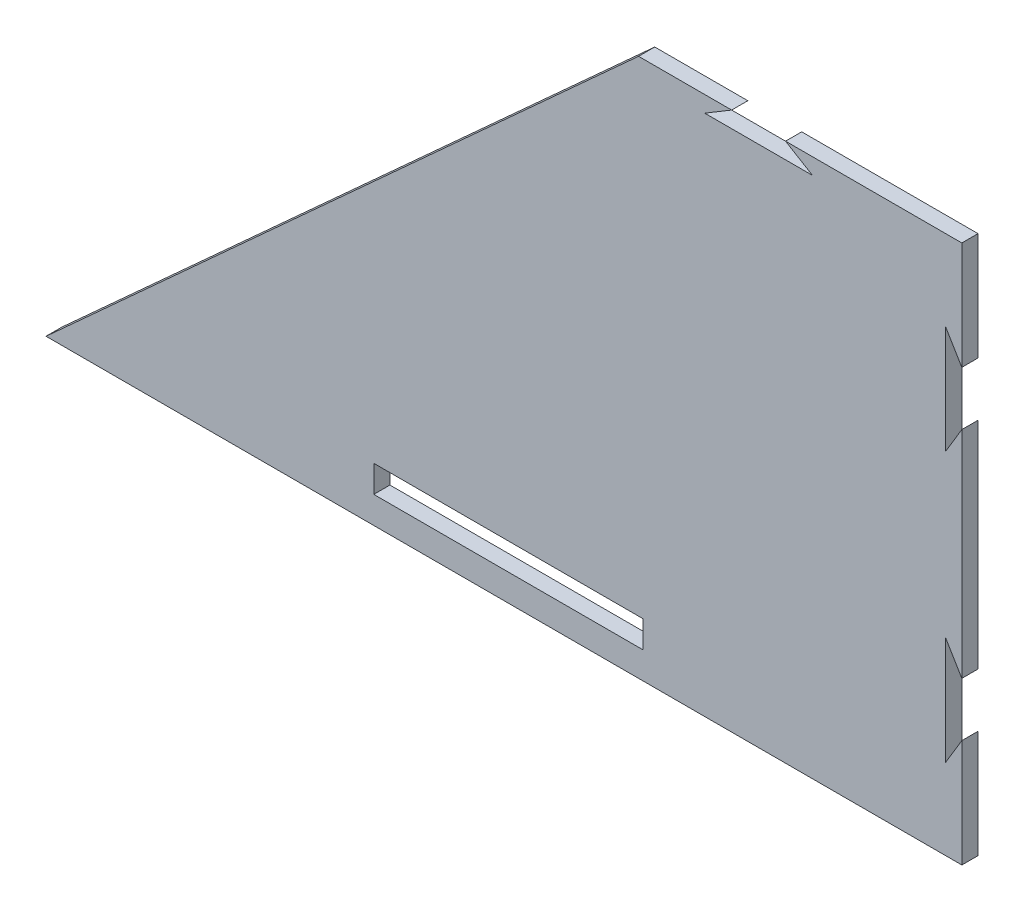
ISO-10303-21;
HEADER;
FILE_DESCRIPTION(('STEP AP214'),'2;1');
FILE_NAME('part.step','',(''),(''),'','','');
FILE_SCHEMA(('AUTOMOTIVE_DESIGN { 1 0 10303 214 1 1 1 1 }'));
ENDSEC;
DATA;
#1=APPLICATION_CONTEXT('core data for automotive mechanical design processes');
#2=APPLICATION_PROTOCOL_DEFINITION('international standard','automotive_design',2000,#1);
#3=PRODUCT_CONTEXT('',#1,'mechanical');
#4=PRODUCT('Part','Part','',(#3));
#5=PRODUCT_RELATED_PRODUCT_CATEGORY('part','',(#4));
#6=PRODUCT_DEFINITION_FORMATION('','',#4);
#7=PRODUCT_DEFINITION_CONTEXT('part definition',#1,'design');
#8=PRODUCT_DEFINITION('design','',#6,#7);
#9=PRODUCT_DEFINITION_SHAPE('','',#8);
#10=(LENGTH_UNIT() NAMED_UNIT(*) SI_UNIT(.MILLI.,.METRE.));
#11=(NAMED_UNIT(*) PLANE_ANGLE_UNIT() SI_UNIT($,.RADIAN.));
#12=(NAMED_UNIT(*) SI_UNIT($,.STERADIAN.) SOLID_ANGLE_UNIT());
#13=UNCERTAINTY_MEASURE_WITH_UNIT(LENGTH_MEASURE(1.E-05),#10,'distance_accuracy_value','');
#14=(GEOMETRIC_REPRESENTATION_CONTEXT(3) GLOBAL_UNCERTAINTY_ASSIGNED_CONTEXT((#13)) GLOBAL_UNIT_ASSIGNED_CONTEXT((#10,
#11,#12)) REPRESENTATION_CONTEXT('',''));
#15=CARTESIAN_POINT('',(0.,0.,0.));
#16=DIRECTION('',(0.,0.,1.));
#17=DIRECTION('',(1.,0.,0.));
#18=AXIS2_PLACEMENT_3D('',#15,#16,#17);
#19=CARTESIAN_POINT('',(91.7278977526352,-71.9753086419754,3.));
#20=DIRECTION('',(-1.,0.,0.));
#21=DIRECTION('',(0.,0.,1.));
#22=AXIS2_PLACEMENT_3D('',#19,#20,#21);
#23=PLANE('',#22);
#24=DIRECTION('',(0.,1.,0.));
#25=VECTOR('',#24,1.);
#26=CARTESIAN_POINT('',(91.7278977526352,-71.9753086419754,0.));
#27=LINE('',#26,#25);
#28=CARTESIAN_POINT('',(91.7278977526352,-41.9753086419754,0.));
#29=VERTEX_POINT('',#28);
#30=CARTESIAN_POINT('',(91.7278977526352,-1.97530864197536,0.));
#31=VERTEX_POINT('',#30);
#32=EDGE_CURVE('E303',#29,#31,#27,.T.);
#33=ORIENTED_EDGE('',*,*,#32,.T.);
#34=DIRECTION('',(0.,0.,1.));
#35=VECTOR('',#34,1.);
#36=CARTESIAN_POINT('',(91.7278977526352,-1.97530864197536,0.));
#37=LINE('',#36,#35);
#38=CARTESIAN_POINT('',(91.7278977526352,-1.97530864197536,3.));
#39=VERTEX_POINT('',#38);
#40=EDGE_CURVE('E226',#31,#39,#37,.T.);
#41=ORIENTED_EDGE('',*,*,#40,.T.);
#42=DIRECTION('',(0.,1.,0.));
#43=VECTOR('',#42,1.);
#44=CARTESIAN_POINT('',(91.7278977526352,-71.9753086419754,3.));
#45=LINE('',#44,#43);
#46=CARTESIAN_POINT('',(91.7278977526352,-41.9753086419754,3.));
#47=VERTEX_POINT('',#46);
#48=EDGE_CURVE('E289',#47,#39,#45,.T.);
#49=ORIENTED_EDGE('',*,*,#48,.F.);
#50=DIRECTION('',(0.,0.,1.));
#51=VECTOR('',#50,1.);
#52=CARTESIAN_POINT('',(91.7278977526352,-41.9753086419754,0.));
#53=LINE('',#52,#51);
#54=EDGE_CURVE('E245',#29,#47,#53,.T.);
#55=ORIENTED_EDGE('',*,*,#54,.F.);
#56=EDGE_LOOP('',(#33,#41,#49,#55));
#57=FACE_BOUND('',#56,.T.);
#58=ADVANCED_FACE('F33',(#57),#23,.F.);
#59=CARTESIAN_POINT('',(91.7278977526352,-71.9753086419754,0.));
#60=VERTEX_POINT('',#59);
#61=CARTESIAN_POINT('',(91.7278977526352,-51.9753086419754,0.));
#62=VERTEX_POINT('',#61);
#63=EDGE_CURVE('E299',#60,#62,#27,.T.);
#64=ORIENTED_EDGE('',*,*,#63,.T.);
#65=DIRECTION('',(0.,0.,1.));
#66=VECTOR('',#65,1.);
#67=CARTESIAN_POINT('',(91.7278977526352,-51.9753086419754,0.));
#68=LINE('',#67,#66);
#69=CARTESIAN_POINT('',(91.7278977526352,-51.9753086419754,3.));
#70=VERTEX_POINT('',#69);
#71=EDGE_CURVE('E222',#62,#70,#68,.T.);
#72=ORIENTED_EDGE('',*,*,#71,.T.);
#73=CARTESIAN_POINT('',(91.7278977526352,-71.9753086419754,3.));
#74=VERTEX_POINT('',#73);
#75=EDGE_CURVE('E285',#74,#70,#45,.T.);
#76=ORIENTED_EDGE('',*,*,#75,.F.);
#77=DIRECTION('',(0.,0.,-1.));
#78=VECTOR('',#77,1.);
#79=CARTESIAN_POINT('',(91.7278977526352,-71.9753086419754,3.));
#80=LINE('',#79,#78);
#81=EDGE_CURVE('E298',#74,#60,#80,.T.);
#82=ORIENTED_EDGE('',*,*,#81,.T.);
#83=EDGE_LOOP('',(#64,#72,#76,#82));
#84=FACE_BOUND('',#83,.T.);
#85=ADVANCED_FACE('F333',(#84),#23,.F.);
#86=CARTESIAN_POINT('',(31.7278977526352,28.0246913580246,3.));
#87=DIRECTION('',(0.,-1.,0.));
#88=DIRECTION('',(0.,0.,-1.));
#89=AXIS2_PLACEMENT_3D('',#86,#87,#88);
#90=PLANE('',#89);
#91=DIRECTION('',(0.,0.,-1.));
#92=VECTOR('',#91,1.);
#93=CARTESIAN_POINT('',(59.0020861881907,28.0246913580246,253.317054774153));
#94=LINE('',#93,#92);
#95=CARTESIAN_POINT('',(59.0020861881907,28.0246913580246,3.));
#96=VERTEX_POINT('',#95);
#97=CARTESIAN_POINT('',(59.0020861881907,28.0246913580246,0.));
#98=VERTEX_POINT('',#97);
#99=EDGE_CURVE('E278',#96,#98,#94,.T.);
#100=ORIENTED_EDGE('',*,*,#99,.F.);
#101=DIRECTION('',(-1.,0.,0.));
#102=VECTOR('',#101,1.);
#103=CARTESIAN_POINT('',(31.7278977526352,28.0246913580246,3.));
#104=LINE('',#103,#102);
#105=CARTESIAN_POINT('',(91.7278977526352,28.0246913580246,3.));
#106=VERTEX_POINT('',#105);
#107=EDGE_CURVE('E291',#106,#96,#104,.T.);
#108=ORIENTED_EDGE('',*,*,#107,.F.);
#109=DIRECTION('',(0.,0.,-1.));
#110=VECTOR('',#109,1.);
#111=CARTESIAN_POINT('',(91.7278977526352,28.0246913580246,3.));
#112=LINE('',#111,#110);
#113=CARTESIAN_POINT('',(91.7278977526352,28.0246913580246,0.));
#114=VERTEX_POINT('',#113);
#115=EDGE_CURVE('E11',#106,#114,#112,.T.);
#116=ORIENTED_EDGE('',*,*,#115,.T.);
#117=DIRECTION('',(-1.,0.,0.));
#118=VECTOR('',#117,1.);
#119=CARTESIAN_POINT('',(31.7278977526352,28.0246913580246,0.));
#120=LINE('',#119,#118);
#121=EDGE_CURVE('E304',#114,#98,#120,.T.);
#122=ORIENTED_EDGE('',*,*,#121,.T.);
#123=EDGE_LOOP('',(#100,#108,#116,#122));
#124=FACE_BOUND('',#123,.T.);
#125=ADVANCED_FACE('F355',(#124),#90,.F.);
#126=DIRECTION('',(0.,0.,-1.));
#127=VECTOR('',#126,1.);
#128=CARTESIAN_POINT('',(49.0020861881907,28.0246913580246,253.317054774153));
#129=LINE('',#128,#127);
#130=CARTESIAN_POINT('',(49.0020861881907,28.0246913580247,3.));
#131=VERTEX_POINT('',#130);
#132=CARTESIAN_POINT('',(49.0020861881907,28.0246913580246,0.));
#133=VERTEX_POINT('',#132);
#134=EDGE_CURVE('E262',#131,#133,#129,.T.);
#135=ORIENTED_EDGE('',*,*,#134,.T.);
#136=CARTESIAN_POINT('',(31.7278977526352,28.0246913580246,0.));
#137=VERTEX_POINT('',#136);
#138=EDGE_CURVE('E302',#133,#137,#120,.T.);
#139=ORIENTED_EDGE('',*,*,#138,.T.);
#140=DIRECTION('',(0.,0.,-1.));
#141=VECTOR('',#140,1.);
#142=CARTESIAN_POINT('',(31.7278977526352,28.0246913580246,3.));
#143=LINE('',#142,#141);
#144=CARTESIAN_POINT('',(31.7278977526352,28.0246913580246,3.));
#145=VERTEX_POINT('',#144);
#146=EDGE_CURVE('E41',#145,#137,#143,.T.);
#147=ORIENTED_EDGE('',*,*,#146,.F.);
#148=EDGE_CURVE('E288',#131,#145,#104,.T.);
#149=ORIENTED_EDGE('',*,*,#148,.F.);
#150=EDGE_LOOP('',(#135,#139,#147,#149));
#151=FACE_BOUND('',#150,.T.);
#152=ADVANCED_FACE('F341',(#151),#90,.F.);
#153=CARTESIAN_POINT('',(0.,0.,3.));
#154=DIRECTION('',(0.,0.,-1.));
#155=DIRECTION('',(-1.,0.,0.));
#156=AXIS2_PLACEMENT_3D('',#153,#154,#155);
#157=PLANE('',#156);
#158=DIRECTION('',(-1.,0.,0.));
#159=VECTOR('',#158,1.);
#160=CARTESIAN_POINT('',(-17.4311719482176,-61.9753086419754,3.));
#161=LINE('',#160,#159);
#162=CARTESIAN_POINT('',(32.5688280517824,-61.9753086419754,3.));
#163=VERTEX_POINT('',#162);
#164=CARTESIAN_POINT('',(-17.4311719482176,-61.9753086419754,3.));
#165=VERTEX_POINT('',#164);
#166=EDGE_CURVE('E197',#163,#165,#161,.T.);
#167=ORIENTED_EDGE('',*,*,#166,.F.);
#168=DIRECTION('',(0.,1.,0.));
#169=VECTOR('',#168,1.);
#170=CARTESIAN_POINT('',(32.5688280517824,-61.9753086419754,3.));
#171=LINE('',#170,#169);
#172=CARTESIAN_POINT('',(32.5688280517824,-66.9753086419754,3.));
#173=VERTEX_POINT('',#172);
#174=EDGE_CURVE('E48',#173,#163,#171,.T.);
#175=ORIENTED_EDGE('',*,*,#174,.F.);
#176=DIRECTION('',(1.,0.,0.));
#177=VECTOR('',#176,1.);
#178=CARTESIAN_POINT('',(-17.4311719482176,-66.9753086419754,3.));
#179=LINE('',#178,#177);
#180=CARTESIAN_POINT('',(-17.4311719482176,-66.9753086419754,3.));
#181=VERTEX_POINT('',#180);
#182=EDGE_CURVE('E188',#181,#173,#179,.T.);
#183=ORIENTED_EDGE('',*,*,#182,.F.);
#184=DIRECTION('',(0.,-1.,0.));
#185=VECTOR('',#184,1.);
#186=CARTESIAN_POINT('',(-17.4311719482176,-61.9753086419754,3.));
#187=LINE('',#186,#185);
#188=EDGE_CURVE('E191',#165,#181,#187,.T.);
#189=ORIENTED_EDGE('',*,*,#188,.F.);
#190=EDGE_LOOP('',(#167,#175,#183,#189));
#191=FACE_BOUND('',#190,.T.);
#192=ORIENTED_EDGE('',*,*,#48,.T.);
#193=DIRECTION('',(0.514495755427527,0.857492925712544,0.));
#194=VECTOR('',#193,1.);
#195=CARTESIAN_POINT('',(88.7278977526352,-6.97530864197536,3.));
#196=LINE('',#195,#194);
#197=CARTESIAN_POINT('',(88.7278977526352,-6.97530864197536,3.));
#198=VERTEX_POINT('',#197);
#199=EDGE_CURVE('E211',#198,#39,#196,.T.);
#200=ORIENTED_EDGE('',*,*,#199,.F.);
#201=DIRECTION('',(0.,-1.,0.));
#202=VECTOR('',#201,1.);
#203=CARTESIAN_POINT('',(88.7278977526352,13.0246913580246,3.));
#204=LINE('',#203,#202);
#205=CARTESIAN_POINT('',(88.7278977526352,13.0246913580246,3.));
#206=VERTEX_POINT('',#205);
#207=EDGE_CURVE('E221',#206,#198,#204,.T.);
#208=ORIENTED_EDGE('',*,*,#207,.F.);
#209=DIRECTION('',(-0.514495755427527,0.857492925712544,0.));
#210=VECTOR('',#209,1.);
#211=CARTESIAN_POINT('',(91.7278977526352,8.02469135802464,3.));
#212=LINE('',#211,#210);
#213=CARTESIAN_POINT('',(91.7278977526352,8.02469135802464,3.));
#214=VERTEX_POINT('',#213);
#215=EDGE_CURVE('E218',#214,#206,#212,.T.);
#216=ORIENTED_EDGE('',*,*,#215,.F.);
#217=EDGE_CURVE('E290',#214,#106,#45,.T.);
#218=ORIENTED_EDGE('',*,*,#217,.T.);
#219=ORIENTED_EDGE('',*,*,#107,.T.);
#220=DIRECTION('',(0.857492925712544,-0.514495755427527,0.));
#221=VECTOR('',#220,1.);
#222=CARTESIAN_POINT('',(64.0020861881907,25.0246913580246,3.));
#223=LINE('',#222,#221);
#224=CARTESIAN_POINT('',(64.0020861881907,25.0246913580246,3.));
#225=VERTEX_POINT('',#224);
#226=EDGE_CURVE('E229',#96,#225,#223,.T.);
#227=ORIENTED_EDGE('',*,*,#226,.T.);
#228=DIRECTION('',(-1.,0.,0.));
#229=VECTOR('',#228,1.);
#230=CARTESIAN_POINT('',(44.0020861881907,25.0246913580246,3.));
#231=LINE('',#230,#229);
#232=CARTESIAN_POINT('',(44.0020861881907,25.0246913580246,3.));
#233=VERTEX_POINT('',#232);
#234=EDGE_CURVE('E271',#225,#233,#231,.T.);
#235=ORIENTED_EDGE('',*,*,#234,.T.);
#236=DIRECTION('',(0.857492925712544,0.514495755427527,0.));
#237=VECTOR('',#236,1.);
#238=CARTESIAN_POINT('',(49.0020861881907,28.0246913580246,3.));
#239=LINE('',#238,#237);
#240=EDGE_CURVE('E267',#233,#131,#239,.T.);
#241=ORIENTED_EDGE('',*,*,#240,.T.);
#242=ORIENTED_EDGE('',*,*,#148,.T.);
#243=DIRECTION('',(-0.739940073395944,-0.672672793996313,0.));
#244=VECTOR('',#243,1.);
#245=CARTESIAN_POINT('',(-78.2721022473648,-71.9753086419754,3.));
#246=LINE('',#245,#244);
#247=CARTESIAN_POINT('',(-78.2721022473648,-71.9753086419754,3.));
#248=VERTEX_POINT('',#247);
#249=EDGE_CURVE('E294',#145,#248,#246,.T.);
#250=ORIENTED_EDGE('',*,*,#249,.T.);
#251=DIRECTION('',(1.,0.,0.));
#252=VECTOR('',#251,1.);
#253=CARTESIAN_POINT('',(-78.2721022473648,-71.9753086419754,3.));
#254=LINE('',#253,#252);
#255=EDGE_CURVE('E296',#248,#74,#254,.T.);
#256=ORIENTED_EDGE('',*,*,#255,.T.);
#257=ORIENTED_EDGE('',*,*,#75,.T.);
#258=DIRECTION('',(0.514495755427527,0.857492925712544,0.));
#259=VECTOR('',#258,1.);
#260=CARTESIAN_POINT('',(88.7278977526352,-56.9753086419754,3.));
#261=LINE('',#260,#259);
#262=CARTESIAN_POINT('',(88.7278977526352,-56.9753086419754,3.));
#263=VERTEX_POINT('',#262);
#264=EDGE_CURVE('E239',#263,#70,#261,.T.);
#265=ORIENTED_EDGE('',*,*,#264,.F.);
#266=DIRECTION('',(0.,-1.,0.));
#267=VECTOR('',#266,1.);
#268=CARTESIAN_POINT('',(88.7278977526352,-36.9753086419754,3.));
#269=LINE('',#268,#267);
#270=CARTESIAN_POINT('',(88.7278977526352,-36.9753086419754,3.));
#271=VERTEX_POINT('',#270);
#272=EDGE_CURVE('E248',#271,#263,#269,.T.);
#273=ORIENTED_EDGE('',*,*,#272,.F.);
#274=DIRECTION('',(-0.514495755427527,0.857492925712544,0.));
#275=VECTOR('',#274,1.);
#276=CARTESIAN_POINT('',(91.7278977526352,-41.9753086419754,3.));
#277=LINE('',#276,#275);
#278=EDGE_CURVE('E203',#47,#271,#277,.T.);
#279=ORIENTED_EDGE('',*,*,#278,.F.);
#280=EDGE_LOOP('',(#192,#200,#208,#216,#218,#219,#227,#235,#241,#242,#250,#256,#257,#265,#273,#279));
#281=FACE_BOUND('',#280,.T.);
#282=ADVANCED_FACE('F337',(#191,#281),#157,.F.);
#283=ORIENTED_EDGE('',*,*,#217,.F.);
#284=DIRECTION('',(0.,0.,1.));
#285=VECTOR('',#284,1.);
#286=CARTESIAN_POINT('',(91.7278977526352,8.02469135802464,0.));
#287=LINE('',#286,#285);
#288=CARTESIAN_POINT('',(91.7278977526352,8.02469135802464,0.));
#289=VERTEX_POINT('',#288);
#290=EDGE_CURVE('E217',#289,#214,#287,.T.);
#291=ORIENTED_EDGE('',*,*,#290,.F.);
#292=EDGE_CURVE('E284',#289,#114,#27,.T.);
#293=ORIENTED_EDGE('',*,*,#292,.T.);
#294=ORIENTED_EDGE('',*,*,#115,.F.);
#295=EDGE_LOOP('',(#283,#291,#293,#294));
#296=FACE_BOUND('',#295,.T.);
#297=ADVANCED_FACE('F35',(#296),#23,.F.);
#298=CARTESIAN_POINT('',(-78.2721022473648,-71.9753086419754,3.));
#299=DIRECTION('',(0.672672793996312,-0.739940073395944,0.));
#300=DIRECTION('',(0.739940073395944,0.672672793996313,0.));
#301=AXIS2_PLACEMENT_3D('',#298,#299,#300);
#302=PLANE('',#301);
#303=DIRECTION('',(-0.739940073395944,-0.672672793996313,0.));
#304=VECTOR('',#303,1.);
#305=CARTESIAN_POINT('',(-78.2721022473648,-71.9753086419754,0.));
#306=LINE('',#305,#304);
#307=CARTESIAN_POINT('',(-78.2721022473648,-71.9753086419754,0.));
#308=VERTEX_POINT('',#307);
#309=EDGE_CURVE('E307',#137,#308,#306,.T.);
#310=ORIENTED_EDGE('',*,*,#309,.T.);
#311=DIRECTION('',(0.,0.,-1.));
#312=VECTOR('',#311,1.);
#313=CARTESIAN_POINT('',(-78.2721022473648,-71.9753086419754,3.));
#314=LINE('',#313,#312);
#315=EDGE_CURVE('E313',#248,#308,#314,.T.);
#316=ORIENTED_EDGE('',*,*,#315,.F.);
#317=ORIENTED_EDGE('',*,*,#249,.F.);
#318=ORIENTED_EDGE('',*,*,#146,.T.);
#319=EDGE_LOOP('',(#310,#316,#317,#318));
#320=FACE_BOUND('',#319,.T.);
#321=ADVANCED_FACE('F320',(#320),#302,.F.);
#322=CARTESIAN_POINT('',(-78.2721022473648,-71.9753086419754,3.));
#323=DIRECTION('',(0.,1.,0.));
#324=DIRECTION('',(0.,0.,1.));
#325=AXIS2_PLACEMENT_3D('',#322,#323,#324);
#326=PLANE('',#325);
#327=DIRECTION('',(1.,0.,0.));
#328=VECTOR('',#327,1.);
#329=CARTESIAN_POINT('',(-78.2721022473648,-71.9753086419754,0.));
#330=LINE('',#329,#328);
#331=EDGE_CURVE('E309',#308,#60,#330,.T.);
#332=ORIENTED_EDGE('',*,*,#331,.T.);
#333=ORIENTED_EDGE('',*,*,#81,.F.);
#334=ORIENTED_EDGE('',*,*,#255,.F.);
#335=ORIENTED_EDGE('',*,*,#315,.T.);
#336=EDGE_LOOP('',(#332,#333,#334,#335));
#337=FACE_BOUND('',#336,.T.);
#338=ADVANCED_FACE('F329',(#337),#326,.F.);
#339=CARTESIAN_POINT('',(0.,0.,0.));
#340=DIRECTION('',(0.,0.,-1.));
#341=DIRECTION('',(-1.,0.,0.));
#342=AXIS2_PLACEMENT_3D('',#339,#340,#341);
#343=PLANE('',#342);
#344=DIRECTION('',(0.,1.,0.));
#345=VECTOR('',#344,1.);
#346=CARTESIAN_POINT('',(32.5688280517824,-61.9753086419754,0.));
#347=LINE('',#346,#345);
#348=CARTESIAN_POINT('',(32.5688280517824,-66.9753086419754,0.));
#349=VERTEX_POINT('',#348);
#350=CARTESIAN_POINT('',(32.5688280517824,-61.9753086419754,0.));
#351=VERTEX_POINT('',#350);
#352=EDGE_CURVE('E172',#349,#351,#347,.T.);
#353=ORIENTED_EDGE('',*,*,#352,.T.);
#354=DIRECTION('',(-1.,0.,0.));
#355=VECTOR('',#354,1.);
#356=CARTESIAN_POINT('',(-17.4311719482176,-61.9753086419754,0.));
#357=LINE('',#356,#355);
#358=CARTESIAN_POINT('',(-17.4311719482176,-61.9753086419754,0.));
#359=VERTEX_POINT('',#358);
#360=EDGE_CURVE('E181',#351,#359,#357,.T.);
#361=ORIENTED_EDGE('',*,*,#360,.T.);
#362=DIRECTION('',(0.,-1.,0.));
#363=VECTOR('',#362,1.);
#364=CARTESIAN_POINT('',(-17.4311719482176,-61.9753086419754,0.));
#365=LINE('',#364,#363);
#366=CARTESIAN_POINT('',(-17.4311719482176,-66.9753086419754,0.));
#367=VERTEX_POINT('',#366);
#368=EDGE_CURVE('E56',#359,#367,#365,.T.);
#369=ORIENTED_EDGE('',*,*,#368,.T.);
#370=DIRECTION('',(1.,0.,0.));
#371=VECTOR('',#370,1.);
#372=CARTESIAN_POINT('',(-17.4311719482176,-66.9753086419754,0.));
#373=LINE('',#372,#371);
#374=EDGE_CURVE('E178',#367,#349,#373,.T.);
#375=ORIENTED_EDGE('',*,*,#374,.T.);
#376=EDGE_LOOP('',(#353,#361,#369,#375));
#377=FACE_BOUND('',#376,.T.);
#378=DIRECTION('',(0.514495755427527,0.857492925712544,0.));
#379=VECTOR('',#378,1.);
#380=CARTESIAN_POINT('',(88.7278977526352,-6.97530864197536,0.));
#381=LINE('',#380,#379);
#382=CARTESIAN_POINT('',(88.7278977526352,-6.97530864197536,0.));
#383=VERTEX_POINT('',#382);
#384=EDGE_CURVE('E214',#383,#31,#381,.T.);
#385=ORIENTED_EDGE('',*,*,#384,.T.);
#386=ORIENTED_EDGE('',*,*,#32,.F.);
#387=DIRECTION('',(-0.514495755427527,0.857492925712544,0.));
#388=VECTOR('',#387,1.);
#389=CARTESIAN_POINT('',(91.7278977526352,-41.9753086419754,0.));
#390=LINE('',#389,#388);
#391=CARTESIAN_POINT('',(88.7278977526352,-36.9753086419754,0.));
#392=VERTEX_POINT('',#391);
#393=EDGE_CURVE('E235',#29,#392,#390,.T.);
#394=ORIENTED_EDGE('',*,*,#393,.T.);
#395=DIRECTION('',(0.,-1.,0.));
#396=VECTOR('',#395,1.);
#397=CARTESIAN_POINT('',(88.7278977526352,-36.9753086419754,0.));
#398=LINE('',#397,#396);
#399=CARTESIAN_POINT('',(88.7278977526352,-56.9753086419754,0.));
#400=VERTEX_POINT('',#399);
#401=EDGE_CURVE('E238',#392,#400,#398,.T.);
#402=ORIENTED_EDGE('',*,*,#401,.T.);
#403=DIRECTION('',(0.514495755427527,0.857492925712544,0.));
#404=VECTOR('',#403,1.);
#405=CARTESIAN_POINT('',(88.7278977526352,-56.9753086419754,0.));
#406=LINE('',#405,#404);
#407=EDGE_CURVE('E242',#400,#62,#406,.T.);
#408=ORIENTED_EDGE('',*,*,#407,.T.);
#409=ORIENTED_EDGE('',*,*,#63,.F.);
#410=ORIENTED_EDGE('',*,*,#331,.F.);
#411=ORIENTED_EDGE('',*,*,#309,.F.);
#412=ORIENTED_EDGE('',*,*,#138,.F.);
#413=DIRECTION('',(0.857492925712544,0.514495755427527,0.));
#414=VECTOR('',#413,1.);
#415=CARTESIAN_POINT('',(49.0020861881907,28.0246913580246,0.));
#416=LINE('',#415,#414);
#417=CARTESIAN_POINT('',(44.0020861881907,25.0246913580246,0.));
#418=VERTEX_POINT('',#417);
#419=EDGE_CURVE('E264',#418,#133,#416,.T.);
#420=ORIENTED_EDGE('',*,*,#419,.F.);
#421=DIRECTION('',(-1.,0.,0.));
#422=VECTOR('',#421,1.);
#423=CARTESIAN_POINT('',(44.0020861881907,25.0246913580246,0.));
#424=LINE('',#423,#422);
#425=CARTESIAN_POINT('',(64.0020861881907,25.0246913580246,0.));
#426=VERTEX_POINT('',#425);
#427=EDGE_CURVE('E263',#426,#418,#424,.T.);
#428=ORIENTED_EDGE('',*,*,#427,.F.);
#429=DIRECTION('',(0.857492925712544,-0.514495755427527,0.));
#430=VECTOR('',#429,1.);
#431=CARTESIAN_POINT('',(64.0020861881907,25.0246913580246,0.));
#432=LINE('',#431,#430);
#433=EDGE_CURVE('E259',#98,#426,#432,.T.);
#434=ORIENTED_EDGE('',*,*,#433,.F.);
#435=ORIENTED_EDGE('',*,*,#121,.F.);
#436=ORIENTED_EDGE('',*,*,#292,.F.);
#437=DIRECTION('',(-0.514495755427527,0.857492925712544,0.));
#438=VECTOR('',#437,1.);
#439=CARTESIAN_POINT('',(91.7278977526352,8.02469135802464,0.));
#440=LINE('',#439,#438);
#441=CARTESIAN_POINT('',(88.7278977526352,13.0246913580246,0.));
#442=VERTEX_POINT('',#441);
#443=EDGE_CURVE('E207',#289,#442,#440,.T.);
#444=ORIENTED_EDGE('',*,*,#443,.T.);
#445=DIRECTION('',(0.,-1.,0.));
#446=VECTOR('',#445,1.);
#447=CARTESIAN_POINT('',(88.7278977526352,13.0246913580246,0.));
#448=LINE('',#447,#446);
#449=EDGE_CURVE('E210',#442,#383,#448,.T.);
#450=ORIENTED_EDGE('',*,*,#449,.T.);
#451=EDGE_LOOP('',(#385,#386,#394,#402,#408,#409,#410,#411,#412,#420,#428,#434,#435,#436,#444,#450));
#452=FACE_BOUND('',#451,.T.);
#453=ADVANCED_FACE('F185',(#377,#452),#343,.T.);
#454=CARTESIAN_POINT('',(64.0020861881907,25.0246913580246,253.317054774153));
#455=DIRECTION('',(-0.514495755427527,-0.857492925712544,0.));
#456=DIRECTION('',(0.857492925712544,-0.514495755427527,0.));
#457=AXIS2_PLACEMENT_3D('',#454,#455,#456);
#458=PLANE('',#457);
#459=ORIENTED_EDGE('',*,*,#226,.F.);
#460=ORIENTED_EDGE('',*,*,#99,.T.);
#461=ORIENTED_EDGE('',*,*,#433,.T.);
#462=DIRECTION('',(0.,0.,-1.));
#463=VECTOR('',#462,1.);
#464=CARTESIAN_POINT('',(64.0020861881907,25.0246913580246,253.317054774153));
#465=LINE('',#464,#463);
#466=EDGE_CURVE('E281',#225,#426,#465,.T.);
#467=ORIENTED_EDGE('',*,*,#466,.F.);
#468=EDGE_LOOP('',(#459,#460,#461,#467));
#469=FACE_BOUND('',#468,.T.);
#470=ADVANCED_FACE('F351',(#469),#458,.T.);
#471=CARTESIAN_POINT('',(44.0020861881907,25.0246913580246,253.317054774153));
#472=DIRECTION('',(0.,1.,0.));
#473=DIRECTION('',(0.,0.,1.));
#474=AXIS2_PLACEMENT_3D('',#471,#472,#473);
#475=PLANE('',#474);
#476=ORIENTED_EDGE('',*,*,#234,.F.);
#477=ORIENTED_EDGE('',*,*,#466,.T.);
#478=ORIENTED_EDGE('',*,*,#427,.T.);
#479=DIRECTION('',(0.,0.,-1.));
#480=VECTOR('',#479,1.);
#481=CARTESIAN_POINT('',(44.0020861881907,25.0246913580246,253.317054774153));
#482=LINE('',#481,#480);
#483=EDGE_CURVE('E275',#233,#418,#482,.T.);
#484=ORIENTED_EDGE('',*,*,#483,.F.);
#485=EDGE_LOOP('',(#476,#477,#478,#484));
#486=FACE_BOUND('',#485,.T.);
#487=ADVANCED_FACE('F347',(#486),#475,.T.);
#488=CARTESIAN_POINT('',(49.0020861881907,28.0246913580246,253.317054774153));
#489=DIRECTION('',(0.514495755427527,-0.857492925712544,0.));
#490=DIRECTION('',(0.857492925712544,0.514495755427527,0.));
#491=AXIS2_PLACEMENT_3D('',#488,#489,#490);
#492=PLANE('',#491);
#493=ORIENTED_EDGE('',*,*,#240,.F.);
#494=ORIENTED_EDGE('',*,*,#483,.T.);
#495=ORIENTED_EDGE('',*,*,#419,.T.);
#496=ORIENTED_EDGE('',*,*,#134,.F.);
#497=EDGE_LOOP('',(#493,#494,#495,#496));
#498=FACE_BOUND('',#497,.T.);
#499=ADVANCED_FACE('F343',(#498),#492,.T.);
#500=CARTESIAN_POINT('',(88.7278977526352,-56.9753086419754,0.));
#501=DIRECTION('',(0.857492925712544,-0.514495755427527,0.));
#502=DIRECTION('',(0.514495755427527,0.857492925712544,0.));
#503=AXIS2_PLACEMENT_3D('',#500,#501,#502);
#504=PLANE('',#503);
#505=ORIENTED_EDGE('',*,*,#264,.T.);
#506=ORIENTED_EDGE('',*,*,#71,.F.);
#507=ORIENTED_EDGE('',*,*,#407,.F.);
#508=DIRECTION('',(0.,0.,1.));
#509=VECTOR('',#508,1.);
#510=CARTESIAN_POINT('',(88.7278977526352,-56.9753086419754,0.));
#511=LINE('',#510,#509);
#512=EDGE_CURVE('E254',#400,#263,#511,.T.);
#513=ORIENTED_EDGE('',*,*,#512,.T.);
#514=EDGE_LOOP('',(#505,#506,#507,#513));
#515=FACE_BOUND('',#514,.T.);
#516=ADVANCED_FACE('F441',(#515),#504,.F.);
#517=CARTESIAN_POINT('',(88.7278977526352,-36.9753086419754,0.));
#518=DIRECTION('',(-1.,0.,0.));
#519=DIRECTION('',(0.,0.,1.));
#520=AXIS2_PLACEMENT_3D('',#517,#518,#519);
#521=PLANE('',#520);
#522=ORIENTED_EDGE('',*,*,#272,.T.);
#523=ORIENTED_EDGE('',*,*,#512,.F.);
#524=ORIENTED_EDGE('',*,*,#401,.F.);
#525=DIRECTION('',(0.,0.,1.));
#526=VECTOR('',#525,1.);
#527=CARTESIAN_POINT('',(88.7278977526352,-36.9753086419754,0.));
#528=LINE('',#527,#526);
#529=EDGE_CURVE('E256',#392,#271,#528,.T.);
#530=ORIENTED_EDGE('',*,*,#529,.T.);
#531=EDGE_LOOP('',(#522,#523,#524,#530));
#532=FACE_BOUND('',#531,.T.);
#533=ADVANCED_FACE('F464',(#532),#521,.F.);
#534=CARTESIAN_POINT('',(91.7278977526352,-41.9753086419754,0.));
#535=DIRECTION('',(0.857492925712544,0.514495755427527,0.));
#536=DIRECTION('',(-0.514495755427527,0.857492925712544,0.));
#537=AXIS2_PLACEMENT_3D('',#534,#535,#536);
#538=PLANE('',#537);
#539=ORIENTED_EDGE('',*,*,#278,.T.);
#540=ORIENTED_EDGE('',*,*,#529,.F.);
#541=ORIENTED_EDGE('',*,*,#393,.F.);
#542=ORIENTED_EDGE('',*,*,#54,.T.);
#543=EDGE_LOOP('',(#539,#540,#541,#542));
#544=FACE_BOUND('',#543,.T.);
#545=ADVANCED_FACE('F385',(#544),#538,.F.);
#546=CARTESIAN_POINT('',(88.7278977526352,-6.97530864197536,0.));
#547=DIRECTION('',(0.857492925712544,-0.514495755427527,0.));
#548=DIRECTION('',(0.514495755427527,0.857492925712544,0.));
#549=AXIS2_PLACEMENT_3D('',#546,#547,#548);
#550=PLANE('',#549);
#551=ORIENTED_EDGE('',*,*,#199,.T.);
#552=ORIENTED_EDGE('',*,*,#40,.F.);
#553=ORIENTED_EDGE('',*,*,#384,.F.);
#554=DIRECTION('',(0.,0.,1.));
#555=VECTOR('',#554,1.);
#556=CARTESIAN_POINT('',(88.7278977526352,-6.97530864197536,0.));
#557=LINE('',#556,#555);
#558=EDGE_CURVE('E230',#383,#198,#557,.T.);
#559=ORIENTED_EDGE('',*,*,#558,.T.);
#560=EDGE_LOOP('',(#551,#552,#553,#559));
#561=FACE_BOUND('',#560,.T.);
#562=ADVANCED_FACE('F368',(#561),#550,.F.);
#563=CARTESIAN_POINT('',(88.7278977526352,13.0246913580246,0.));
#564=DIRECTION('',(-1.,0.,0.));
#565=DIRECTION('',(0.,0.,1.));
#566=AXIS2_PLACEMENT_3D('',#563,#564,#565);
#567=PLANE('',#566);
#568=ORIENTED_EDGE('',*,*,#207,.T.);
#569=ORIENTED_EDGE('',*,*,#558,.F.);
#570=ORIENTED_EDGE('',*,*,#449,.F.);
#571=DIRECTION('',(0.,0.,1.));
#572=VECTOR('',#571,1.);
#573=CARTESIAN_POINT('',(88.7278977526352,13.0246913580246,0.));
#574=LINE('',#573,#572);
#575=EDGE_CURVE('E232',#442,#206,#574,.T.);
#576=ORIENTED_EDGE('',*,*,#575,.T.);
#577=EDGE_LOOP('',(#568,#569,#570,#576));
#578=FACE_BOUND('',#577,.T.);
#579=ADVANCED_FACE('F377',(#578),#567,.F.);
#580=CARTESIAN_POINT('',(91.7278977526352,8.02469135802464,0.));
#581=DIRECTION('',(0.857492925712544,0.514495755427527,0.));
#582=DIRECTION('',(-0.514495755427527,0.857492925712544,0.));
#583=AXIS2_PLACEMENT_3D('',#580,#581,#582);
#584=PLANE('',#583);
#585=ORIENTED_EDGE('',*,*,#215,.T.);
#586=ORIENTED_EDGE('',*,*,#575,.F.);
#587=ORIENTED_EDGE('',*,*,#443,.F.);
#588=ORIENTED_EDGE('',*,*,#290,.T.);
#589=EDGE_LOOP('',(#585,#586,#587,#588));
#590=FACE_BOUND('',#589,.T.);
#591=ADVANCED_FACE('F375',(#590),#584,.F.);
#592=CARTESIAN_POINT('',(32.5688280517824,-61.9753086419754,0.));
#593=DIRECTION('',(1.,0.,0.));
#594=DIRECTION('',(0.,0.,-1.));
#595=AXIS2_PLACEMENT_3D('',#592,#593,#594);
#596=PLANE('',#595);
#597=ORIENTED_EDGE('',*,*,#174,.T.);
#598=DIRECTION('',(0.,0.,1.));
#599=VECTOR('',#598,1.);
#600=CARTESIAN_POINT('',(32.5688280517824,-61.9753086419754,0.));
#601=LINE('',#600,#599);
#602=EDGE_CURVE('E168',#351,#163,#601,.T.);
#603=ORIENTED_EDGE('',*,*,#602,.F.);
#604=ORIENTED_EDGE('',*,*,#352,.F.);
#605=DIRECTION('',(0.,0.,1.));
#606=VECTOR('',#605,1.);
#607=CARTESIAN_POINT('',(32.5688280517824,-66.9753086419754,0.));
#608=LINE('',#607,#606);
#609=EDGE_CURVE('E201',#349,#173,#608,.T.);
#610=ORIENTED_EDGE('',*,*,#609,.T.);
#611=EDGE_LOOP('',(#597,#603,#604,#610));
#612=FACE_BOUND('',#611,.T.);
#613=ADVANCED_FACE('F170',(#612),#596,.F.);
#614=CARTESIAN_POINT('',(-17.4311719482176,-66.9753086419754,0.));
#615=DIRECTION('',(0.,-1.,0.));
#616=DIRECTION('',(0.,0.,-1.));
#617=AXIS2_PLACEMENT_3D('',#614,#615,#616);
#618=PLANE('',#617);
#619=ORIENTED_EDGE('',*,*,#182,.T.);
#620=ORIENTED_EDGE('',*,*,#609,.F.);
#621=ORIENTED_EDGE('',*,*,#374,.F.);
#622=DIRECTION('',(0.,0.,1.));
#623=VECTOR('',#622,1.);
#624=CARTESIAN_POINT('',(-17.4311719482176,-66.9753086419754,0.));
#625=LINE('',#624,#623);
#626=EDGE_CURVE('E204',#367,#181,#625,.T.);
#627=ORIENTED_EDGE('',*,*,#626,.T.);
#628=EDGE_LOOP('',(#619,#620,#621,#627));
#629=FACE_BOUND('',#628,.T.);
#630=ADVANCED_FACE('F518',(#629),#618,.F.);
#631=CARTESIAN_POINT('',(-17.4311719482176,-61.9753086419754,0.));
#632=DIRECTION('',(-1.,0.,0.));
#633=DIRECTION('',(0.,0.,1.));
#634=AXIS2_PLACEMENT_3D('',#631,#632,#633);
#635=PLANE('',#634);
#636=ORIENTED_EDGE('',*,*,#188,.T.);
#637=ORIENTED_EDGE('',*,*,#626,.F.);
#638=ORIENTED_EDGE('',*,*,#368,.F.);
#639=DIRECTION('',(0.,0.,1.));
#640=VECTOR('',#639,1.);
#641=CARTESIAN_POINT('',(-17.4311719482176,-61.9753086419754,0.));
#642=LINE('',#641,#640);
#643=EDGE_CURVE('E177',#359,#165,#642,.T.);
#644=ORIENTED_EDGE('',*,*,#643,.T.);
#645=EDGE_LOOP('',(#636,#637,#638,#644));
#646=FACE_BOUND('',#645,.T.);
#647=ADVANCED_FACE('F527',(#646),#635,.F.);
#648=CARTESIAN_POINT('',(-17.4311719482176,-61.9753086419754,0.));
#649=DIRECTION('',(0.,1.,0.));
#650=DIRECTION('',(0.,0.,1.));
#651=AXIS2_PLACEMENT_3D('',#648,#649,#650);
#652=PLANE('',#651);
#653=ORIENTED_EDGE('',*,*,#166,.T.);
#654=ORIENTED_EDGE('',*,*,#643,.F.);
#655=ORIENTED_EDGE('',*,*,#360,.F.);
#656=ORIENTED_EDGE('',*,*,#602,.T.);
#657=EDGE_LOOP('',(#653,#654,#655,#656));
#658=FACE_BOUND('',#657,.T.);
#659=ADVANCED_FACE('F182',(#658),#652,.F.);
#660=CLOSED_SHELL('',(#58,#85,#125,#152,#282,#297,#321,#338,#453,#470,#487,#499,#516,#533,#545,
#562,#579,#591,#613,#630,#647,#659));
#661=MANIFOLD_SOLID_BREP('B2',#660);
#662=ADVANCED_BREP_SHAPE_REPRESENTATION('',(#18,#661),#14);
#663=SHAPE_DEFINITION_REPRESENTATION(#9,#662);
ENDSEC;
END-ISO-10303-21;
